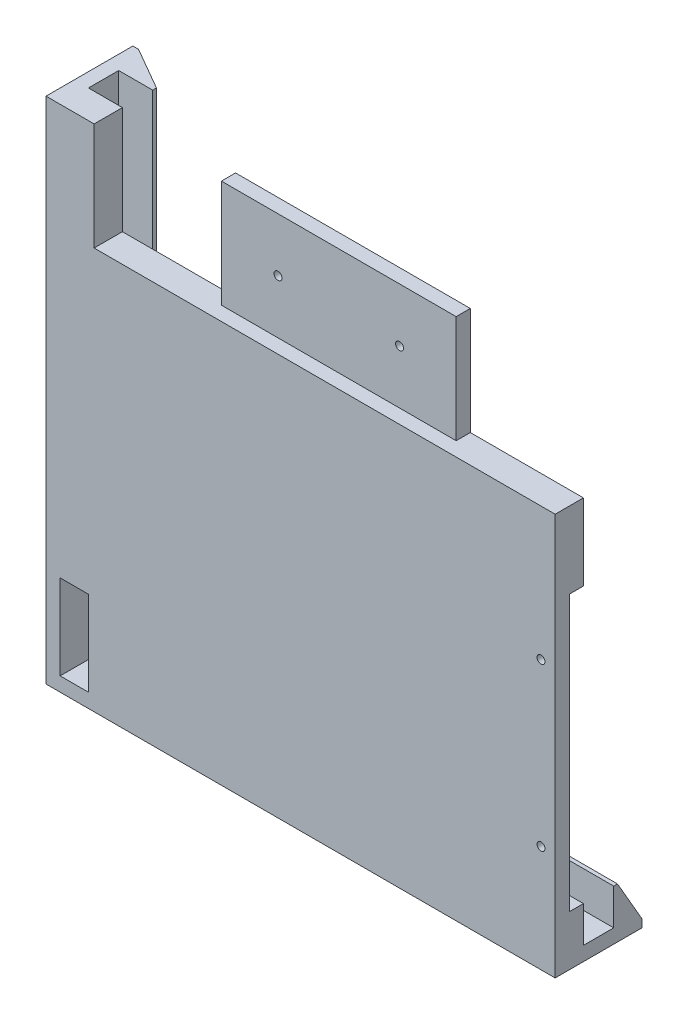
ISO-10303-21;
HEADER;
FILE_DESCRIPTION(('STEP AP214'),'2;1');
FILE_NAME('part.step','',(''),(''),'','','');
FILE_SCHEMA(('AUTOMOTIVE_DESIGN { 1 0 10303 214 1 1 1 1 }'));
ENDSEC;
DATA;
#1=APPLICATION_CONTEXT('core data for automotive mechanical design processes');
#2=APPLICATION_PROTOCOL_DEFINITION('international standard','automotive_design',2000,#1);
#3=PRODUCT_CONTEXT('',#1,'mechanical');
#4=PRODUCT('Part','Part','',(#3));
#5=PRODUCT_RELATED_PRODUCT_CATEGORY('part','',(#4));
#6=PRODUCT_DEFINITION_FORMATION('','',#4);
#7=PRODUCT_DEFINITION_CONTEXT('part definition',#1,'design');
#8=PRODUCT_DEFINITION('design','',#6,#7);
#9=PRODUCT_DEFINITION_SHAPE('','',#8);
#10=(LENGTH_UNIT() NAMED_UNIT(*) SI_UNIT(.MILLI.,.METRE.));
#11=(NAMED_UNIT(*) PLANE_ANGLE_UNIT() SI_UNIT($,.RADIAN.));
#12=(NAMED_UNIT(*) SI_UNIT($,.STERADIAN.) SOLID_ANGLE_UNIT());
#13=UNCERTAINTY_MEASURE_WITH_UNIT(LENGTH_MEASURE(1.E-05),#10,'distance_accuracy_value','');
#14=(GEOMETRIC_REPRESENTATION_CONTEXT(3) GLOBAL_UNCERTAINTY_ASSIGNED_CONTEXT((#13)) GLOBAL_UNIT_ASSIGNED_CONTEXT((#10,
#11,#12)) REPRESENTATION_CONTEXT('',''));
#15=CARTESIAN_POINT('',(0.,0.,0.));
#16=DIRECTION('',(0.,0.,1.));
#17=DIRECTION('',(1.,0.,0.));
#18=AXIS2_PLACEMENT_3D('',#15,#16,#17);
#19=CARTESIAN_POINT('',(0.,180.,30.7));
#20=DIRECTION('',(0.,-1.,0.));
#21=DIRECTION('',(0.,0.,-1.));
#22=AXIS2_PLACEMENT_3D('',#19,#20,#21);
#23=PLANE('',#22);
#24=DIRECTION('',(-1.,0.,0.));
#25=VECTOR('',#24,1.);
#26=CARTESIAN_POINT('',(57.01,180.,25.7));
#27=LINE('',#26,#25);
#28=CARTESIAN_POINT('',(140.,180.,25.7));
#29=VERTEX_POINT('',#28);
#30=CARTESIAN_POINT('',(57.01,180.,25.7));
#31=VERTEX_POINT('',#30);
#32=EDGE_CURVE('E370',#29,#31,#27,.T.);
#33=ORIENTED_EDGE('',*,*,#32,.F.);
#34=DIRECTION('',(0.,0.,-1.));
#35=VECTOR('',#34,1.);
#36=CARTESIAN_POINT('',(140.,180.,30.7));
#37=LINE('',#36,#35);
#38=CARTESIAN_POINT('',(140.,180.,20.7));
#39=VERTEX_POINT('',#38);
#40=EDGE_CURVE('E365',#29,#39,#37,.T.);
#41=ORIENTED_EDGE('',*,*,#40,.T.);
#42=DIRECTION('',(1.,0.,0.));
#43=VECTOR('',#42,1.);
#44=CARTESIAN_POINT('',(180.,180.,20.7));
#45=LINE('',#44,#43);
#46=CARTESIAN_POINT('',(57.01,180.,20.7));
#47=VERTEX_POINT('',#46);
#48=EDGE_CURVE('E255',#47,#39,#45,.T.);
#49=ORIENTED_EDGE('',*,*,#48,.F.);
#50=DIRECTION('',(0.,0.,-1.));
#51=VECTOR('',#50,1.);
#52=CARTESIAN_POINT('',(57.01,180.,30.7));
#53=LINE('',#52,#51);
#54=EDGE_CURVE('E373',#31,#47,#53,.T.);
#55=ORIENTED_EDGE('',*,*,#54,.F.);
#56=EDGE_LOOP('',(#33,#41,#49,#55));
#57=FACE_BOUND('',#56,.T.);
#58=ADVANCED_FACE('F41',(#57),#23,.F.);
#59=CARTESIAN_POINT('',(57.01,142.,30.7));
#60=DIRECTION('',(1.,0.,0.));
#61=DIRECTION('',(0.,0.,-1.));
#62=AXIS2_PLACEMENT_3D('',#59,#60,#61);
#63=PLANE('',#62);
#64=DIRECTION('',(0.,-1.,0.));
#65=VECTOR('',#64,1.);
#66=CARTESIAN_POINT('',(57.01,180.,25.7));
#67=LINE('',#66,#65);
#68=CARTESIAN_POINT('',(57.01,142.,25.7));
#69=VERTEX_POINT('',#68);
#70=EDGE_CURVE('E401',#31,#69,#67,.T.);
#71=ORIENTED_EDGE('',*,*,#70,.F.);
#72=ORIENTED_EDGE('',*,*,#54,.T.);
#73=DIRECTION('',(0.,-1.,0.));
#74=VECTOR('',#73,1.);
#75=CARTESIAN_POINT('',(57.01,142.,20.7));
#76=LINE('',#75,#74);
#77=CARTESIAN_POINT('',(57.01,142.,20.7));
#78=VERTEX_POINT('',#77);
#79=EDGE_CURVE('E367',#47,#78,#76,.T.);
#80=ORIENTED_EDGE('',*,*,#79,.T.);
#81=DIRECTION('',(0.,0.,-1.));
#82=VECTOR('',#81,1.);
#83=CARTESIAN_POINT('',(57.01,142.,30.7));
#84=LINE('',#83,#82);
#85=EDGE_CURVE('E356',#69,#78,#84,.T.);
#86=ORIENTED_EDGE('',*,*,#85,.F.);
#87=EDGE_LOOP('',(#71,#72,#80,#86));
#88=FACE_BOUND('',#87,.T.);
#89=ADVANCED_FACE('F479',(#88),#63,.F.);
#90=CARTESIAN_POINT('',(140.,142.,30.7));
#91=DIRECTION('',(-1.,0.,0.));
#92=DIRECTION('',(0.,0.,1.));
#93=AXIS2_PLACEMENT_3D('',#90,#91,#92);
#94=PLANE('',#93);
#95=DIRECTION('',(0.,1.,0.));
#96=VECTOR('',#95,1.);
#97=CARTESIAN_POINT('',(140.,180.,25.7));
#98=LINE('',#97,#96);
#99=CARTESIAN_POINT('',(140.,142.,25.7));
#100=VERTEX_POINT('',#99);
#101=EDGE_CURVE('E397',#100,#29,#98,.T.);
#102=ORIENTED_EDGE('',*,*,#101,.F.);
#103=DIRECTION('',(0.,0.,-1.));
#104=VECTOR('',#103,1.);
#105=CARTESIAN_POINT('',(140.,142.,30.7));
#106=LINE('',#105,#104);
#107=CARTESIAN_POINT('',(140.,142.,20.7));
#108=VERTEX_POINT('',#107);
#109=EDGE_CURVE('E381',#100,#108,#106,.T.);
#110=ORIENTED_EDGE('',*,*,#109,.T.);
#111=DIRECTION('',(0.,1.,0.));
#112=VECTOR('',#111,1.);
#113=CARTESIAN_POINT('',(140.,142.,20.7));
#114=LINE('',#113,#112);
#115=EDGE_CURVE('E375',#108,#39,#114,.T.);
#116=ORIENTED_EDGE('',*,*,#115,.T.);
#117=ORIENTED_EDGE('',*,*,#40,.F.);
#118=EDGE_LOOP('',(#102,#110,#116,#117));
#119=FACE_BOUND('',#118,.T.);
#120=ADVANCED_FACE('F487',(#119),#94,.F.);
#121=CARTESIAN_POINT('',(0.,0.,30.7));
#122=DIRECTION('',(1.,0.,0.));
#123=DIRECTION('',(0.,0.,-1.));
#124=AXIS2_PLACEMENT_3D('',#121,#122,#123);
#125=PLANE('',#124);
#126=DIRECTION('',(0.,-1.,0.));
#127=VECTOR('',#126,1.);
#128=CARTESIAN_POINT('',(0.,0.,0.));
#129=LINE('',#128,#127);
#130=CARTESIAN_POINT('',(0.,180.,0.));
#131=VERTEX_POINT('',#130);
#132=CARTESIAN_POINT('',(0.,0.,0.));
#133=VERTEX_POINT('',#132);
#134=EDGE_CURVE('E261',#131,#133,#129,.T.);
#135=ORIENTED_EDGE('',*,*,#134,.T.);
#136=DIRECTION('',(0.,0.,-1.));
#137=VECTOR('',#136,1.);
#138=CARTESIAN_POINT('',(0.,0.,30.7));
#139=LINE('',#138,#137);
#140=CARTESIAN_POINT('',(0.,0.,30.7));
#141=VERTEX_POINT('',#140);
#142=EDGE_CURVE('E291',#141,#133,#139,.T.);
#143=ORIENTED_EDGE('',*,*,#142,.F.);
#144=DIRECTION('',(0.,-1.,0.));
#145=VECTOR('',#144,1.);
#146=CARTESIAN_POINT('',(0.,0.,30.7));
#147=LINE('',#146,#145);
#148=CARTESIAN_POINT('',(0.,180.,30.7));
#149=VERTEX_POINT('',#148);
#150=EDGE_CURVE('E266',#149,#141,#147,.T.);
#151=ORIENTED_EDGE('',*,*,#150,.F.);
#152=DIRECTION('',(0.,0.,-1.));
#153=VECTOR('',#152,1.);
#154=CARTESIAN_POINT('',(0.,180.,30.7));
#155=LINE('',#154,#153);
#156=EDGE_CURVE('E277',#149,#131,#155,.T.);
#157=ORIENTED_EDGE('',*,*,#156,.T.);
#158=EDGE_LOOP('',(#135,#143,#151,#157));
#159=FACE_BOUND('',#158,.T.);
#160=ADVANCED_FACE('F343',(#159),#125,.F.);
#161=CARTESIAN_POINT('',(0.,0.,30.7));
#162=DIRECTION('',(0.,1.,0.));
#163=DIRECTION('',(0.,0.,1.));
#164=AXIS2_PLACEMENT_3D('',#161,#162,#163);
#165=PLANE('',#164);
#166=DIRECTION('',(1.,0.,0.));
#167=VECTOR('',#166,1.);
#168=CARTESIAN_POINT('',(0.,0.,0.));
#169=LINE('',#168,#167);
#170=CARTESIAN_POINT('',(180.,0.,0.));
#171=VERTEX_POINT('',#170);
#172=EDGE_CURVE('E280',#133,#171,#169,.T.);
#173=ORIENTED_EDGE('',*,*,#172,.T.);
#174=DIRECTION('',(0.,0.,-1.));
#175=VECTOR('',#174,1.);
#176=CARTESIAN_POINT('',(180.,0.,30.7));
#177=LINE('',#176,#175);
#178=CARTESIAN_POINT('',(180.,0.,30.7));
#179=VERTEX_POINT('',#178);
#180=EDGE_CURVE('E288',#179,#171,#177,.T.);
#181=ORIENTED_EDGE('',*,*,#180,.F.);
#182=DIRECTION('',(1.,0.,0.));
#183=VECTOR('',#182,1.);
#184=CARTESIAN_POINT('',(0.,0.,30.7));
#185=LINE('',#184,#183);
#186=EDGE_CURVE('E269',#141,#179,#185,.T.);
#187=ORIENTED_EDGE('',*,*,#186,.F.);
#188=ORIENTED_EDGE('',*,*,#142,.T.);
#189=EDGE_LOOP('',(#173,#181,#187,#188));
#190=FACE_BOUND('',#189,.T.);
#191=ADVANCED_FACE('F501',(#190),#165,.F.);
#192=CARTESIAN_POINT('',(180.,0.,30.7));
#193=DIRECTION('',(-1.,0.,0.));
#194=DIRECTION('',(0.,0.,1.));
#195=AXIS2_PLACEMENT_3D('',#192,#193,#194);
#196=PLANE('',#195);
#197=DIRECTION('',(0.,1.,0.));
#198=VECTOR('',#197,1.);
#199=CARTESIAN_POINT('',(180.,0.,0.));
#200=LINE('',#199,#198);
#201=CARTESIAN_POINT('',(180.,2.7899999999999,0.));
#202=VERTEX_POINT('',#201);
#203=EDGE_CURVE('E282',#171,#202,#200,.T.);
#204=ORIENTED_EDGE('',*,*,#203,.T.);
#205=DIRECTION('',(0.,0.86602540378444,0.499999999999997));
#206=VECTOR('',#205,1.);
#207=CARTESIAN_POINT('',(180.,17.79,8.66025403784437));
#208=LINE('',#207,#206);
#209=CARTESIAN_POINT('',(180.,17.79,8.66025403784437));
#210=VERTEX_POINT('',#209);
#211=EDGE_CURVE('E317',#202,#210,#208,.T.);
#212=ORIENTED_EDGE('',*,*,#211,.T.);
#213=DIRECTION('',(0.,0.,-1.));
#214=VECTOR('',#213,1.);
#215=CARTESIAN_POINT('',(180.,17.79,20.7));
#216=LINE('',#215,#214);
#217=CARTESIAN_POINT('',(180.,17.79,10.));
#218=VERTEX_POINT('',#217);
#219=EDGE_CURVE('E258',#218,#210,#216,.T.);
#220=ORIENTED_EDGE('',*,*,#219,.F.);
#221=DIRECTION('',(0.,1.,0.));
#222=VECTOR('',#221,1.);
#223=CARTESIAN_POINT('',(180.,-175.326809130834,10.));
#224=LINE('',#223,#222);
#225=CARTESIAN_POINT('',(180.,5.,10.));
#226=VERTEX_POINT('',#225);
#227=EDGE_CURVE('E239',#226,#218,#224,.T.);
#228=ORIENTED_EDGE('',*,*,#227,.F.);
#229=DIRECTION('',(0.,0.,1.));
#230=VECTOR('',#229,1.);
#231=CARTESIAN_POINT('',(180.,5.,20.7));
#232=LINE('',#231,#230);
#233=CARTESIAN_POINT('',(180.,5.,20.7));
#234=VERTEX_POINT('',#233);
#235=EDGE_CURVE('E248',#226,#234,#232,.T.);
#236=ORIENTED_EDGE('',*,*,#235,.T.);
#237=DIRECTION('',(0.,-1.,0.));
#238=VECTOR('',#237,1.);
#239=CARTESIAN_POINT('',(180.,17.79,20.7));
#240=LINE('',#239,#238);
#241=CARTESIAN_POINT('',(180.,17.79,20.7));
#242=VERTEX_POINT('',#241);
#243=EDGE_CURVE('E251',#242,#234,#240,.T.);
#244=ORIENTED_EDGE('',*,*,#243,.F.);
#245=DIRECTION('',(0.,0.,-1.));
#246=VECTOR('',#245,1.);
#247=CARTESIAN_POINT('',(180.,17.79,25.7));
#248=LINE('',#247,#246);
#249=CARTESIAN_POINT('',(180.,17.79,25.7));
#250=VERTEX_POINT('',#249);
#251=EDGE_CURVE('E412',#250,#242,#248,.T.);
#252=ORIENTED_EDGE('',*,*,#251,.F.);
#253=DIRECTION('',(0.,-1.,0.));
#254=VECTOR('',#253,1.);
#255=CARTESIAN_POINT('',(180.,115.,25.7));
#256=LINE('',#255,#254);
#257=CARTESIAN_POINT('',(180.,115.,25.7));
#258=VERTEX_POINT('',#257);
#259=EDGE_CURVE('E426',#258,#250,#256,.T.);
#260=ORIENTED_EDGE('',*,*,#259,.F.);
#261=DIRECTION('',(0.,0.,-1.));
#262=VECTOR('',#261,1.);
#263=CARTESIAN_POINT('',(180.,115.,25.7));
#264=LINE('',#263,#262);
#265=CARTESIAN_POINT('',(180.,115.,20.7));
#266=VERTEX_POINT('',#265);
#267=EDGE_CURVE('E408',#258,#266,#264,.T.);
#268=ORIENTED_EDGE('',*,*,#267,.T.);
#269=CARTESIAN_POINT('',(180.,142.,20.7));
#270=VERTEX_POINT('',#269);
#271=EDGE_CURVE('E252',#270,#266,#240,.T.);
#272=ORIENTED_EDGE('',*,*,#271,.F.);
#273=DIRECTION('',(0.,0.,-1.));
#274=VECTOR('',#273,1.);
#275=CARTESIAN_POINT('',(180.,142.,30.7));
#276=LINE('',#275,#274);
#277=CARTESIAN_POINT('',(180.,142.,30.7));
#278=VERTEX_POINT('',#277);
#279=EDGE_CURVE('E384',#278,#270,#276,.T.);
#280=ORIENTED_EDGE('',*,*,#279,.F.);
#281=DIRECTION('',(0.,1.,0.));
#282=VECTOR('',#281,1.);
#283=CARTESIAN_POINT('',(180.,0.,30.7));
#284=LINE('',#283,#282);
#285=EDGE_CURVE('E272',#179,#278,#284,.T.);
#286=ORIENTED_EDGE('',*,*,#285,.F.);
#287=ORIENTED_EDGE('',*,*,#180,.T.);
#288=EDGE_LOOP('',(#204,#212,#220,#228,#236,#244,#252,#260,#268,#272,#280,#286,#287));
#289=FACE_BOUND('',#288,.T.);
#290=ADVANCED_FACE('F322',(#289),#196,.F.);
#291=DIRECTION('',(0.,0.,-1.));
#292=VECTOR('',#291,1.);
#293=CARTESIAN_POINT('',(17.01,180.,20.7));
#294=LINE('',#293,#292);
#295=CARTESIAN_POINT('',(17.01,180.,10.));
#296=VERTEX_POINT('',#295);
#297=CARTESIAN_POINT('',(17.01,180.,8.66025403784437));
#298=VERTEX_POINT('',#297);
#299=EDGE_CURVE('E259',#296,#298,#294,.T.);
#300=ORIENTED_EDGE('',*,*,#299,.T.);
#301=DIRECTION('',(-0.86602540378444,0.,-0.499999999999997));
#302=VECTOR('',#301,1.);
#303=CARTESIAN_POINT('',(17.01,180.,8.66025403784437));
#304=LINE('',#303,#302);
#305=CARTESIAN_POINT('',(2.0099999999999,180.,0.));
#306=VERTEX_POINT('',#305);
#307=EDGE_CURVE('E12',#298,#306,#304,.T.);
#308=ORIENTED_EDGE('',*,*,#307,.T.);
#309=DIRECTION('',(-1.,0.,0.));
#310=VECTOR('',#309,1.);
#311=CARTESIAN_POINT('',(0.,180.,0.));
#312=LINE('',#311,#310);
#313=EDGE_CURVE('E270',#306,#131,#312,.T.);
#314=ORIENTED_EDGE('',*,*,#313,.T.);
#315=ORIENTED_EDGE('',*,*,#156,.F.);
#316=DIRECTION('',(-1.,0.,0.));
#317=VECTOR('',#316,1.);
#318=CARTESIAN_POINT('',(0.,180.,30.7));
#319=LINE('',#318,#317);
#320=CARTESIAN_POINT('',(17.01,180.,30.7));
#321=VERTEX_POINT('',#320);
#322=EDGE_CURVE('E275',#321,#149,#319,.T.);
#323=ORIENTED_EDGE('',*,*,#322,.F.);
#324=DIRECTION('',(0.,0.,-1.));
#325=VECTOR('',#324,1.);
#326=CARTESIAN_POINT('',(17.01,180.,30.7));
#327=LINE('',#326,#325);
#328=CARTESIAN_POINT('',(17.01,180.,20.7));
#329=VERTEX_POINT('',#328);
#330=EDGE_CURVE('E347',#321,#329,#327,.T.);
#331=ORIENTED_EDGE('',*,*,#330,.T.);
#332=CARTESIAN_POINT('',(5.,180.,20.7));
#333=VERTEX_POINT('',#332);
#334=EDGE_CURVE('E256',#333,#329,#45,.T.);
#335=ORIENTED_EDGE('',*,*,#334,.F.);
#336=DIRECTION('',(0.,0.,1.));
#337=VECTOR('',#336,1.);
#338=CARTESIAN_POINT('',(5.,180.,20.7));
#339=LINE('',#338,#337);
#340=CARTESIAN_POINT('',(5.,180.,10.));
#341=VERTEX_POINT('',#340);
#342=EDGE_CURVE('E233',#341,#333,#339,.T.);
#343=ORIENTED_EDGE('',*,*,#342,.F.);
#344=DIRECTION('',(-1.,0.,0.));
#345=VECTOR('',#344,1.);
#346=CARTESIAN_POINT('',(180.,180.,10.));
#347=LINE('',#346,#345);
#348=EDGE_CURVE('E380',#296,#341,#347,.T.);
#349=ORIENTED_EDGE('',*,*,#348,.F.);
#350=EDGE_LOOP('',(#300,#308,#314,#315,#323,#331,#335,#343,#349));
#351=FACE_BOUND('',#350,.T.);
#352=ADVANCED_FACE('F336',(#351),#23,.F.);
#353=CARTESIAN_POINT('',(0.,0.,30.7));
#354=DIRECTION('',(0.,0.,-1.));
#355=DIRECTION('',(-1.,0.,0.));
#356=AXIS2_PLACEMENT_3D('',#353,#354,#355);
#357=PLANE('',#356);
#358=CARTESIAN_POINT('',(175.,37.79,30.7));
#359=DIRECTION('',(0.,0.,-1.));
#360=DIRECTION('',(-1.,0.,0.));
#361=AXIS2_PLACEMENT_3D('',#358,#359,#360);
#362=CIRCLE('',#361,1.4);
#363=CARTESIAN_POINT('',(173.6,37.79,30.7));
#364=VERTEX_POINT('',#363);
#365=EDGE_CURVE('E306',#364,#364,#362,.T.);
#366=ORIENTED_EDGE('',*,*,#365,.T.);
#367=EDGE_LOOP('',(#366));
#368=FACE_BOUND('',#367,.T.);
#369=CARTESIAN_POINT('',(175.,95.,30.7));
#370=DIRECTION('',(0.,0.,-1.));
#371=DIRECTION('',(-1.,0.,0.));
#372=AXIS2_PLACEMENT_3D('',#369,#370,#371);
#373=CIRCLE('',#372,1.4);
#374=CARTESIAN_POINT('',(173.6,95.,30.7));
#375=VERTEX_POINT('',#374);
#376=EDGE_CURVE('E301',#375,#375,#373,.T.);
#377=ORIENTED_EDGE('',*,*,#376,.T.);
#378=EDGE_LOOP('',(#377));
#379=FACE_BOUND('',#378,.T.);
#380=DIRECTION('',(-1.,0.,0.));
#381=VECTOR('',#380,1.);
#382=CARTESIAN_POINT('',(0.,5.,30.7));
#383=LINE('',#382,#381);
#384=CARTESIAN_POINT('',(15.,5.,30.7));
#385=VERTEX_POINT('',#384);
#386=CARTESIAN_POINT('',(5.,5.,30.7));
#387=VERTEX_POINT('',#386);
#388=EDGE_CURVE('E434',#385,#387,#383,.T.);
#389=ORIENTED_EDGE('',*,*,#388,.T.);
#390=DIRECTION('',(0.,1.,0.));
#391=VECTOR('',#390,1.);
#392=CARTESIAN_POINT('',(5.,0.,30.7));
#393=LINE('',#392,#391);
#394=CARTESIAN_POINT('',(5.,35.,30.7));
#395=VERTEX_POINT('',#394);
#396=EDGE_CURVE('E423',#387,#395,#393,.T.);
#397=ORIENTED_EDGE('',*,*,#396,.T.);
#398=DIRECTION('',(1.,0.,0.));
#399=VECTOR('',#398,1.);
#400=CARTESIAN_POINT('',(0.,35.,30.7));
#401=LINE('',#400,#399);
#402=CARTESIAN_POINT('',(15.,35.,30.7));
#403=VERTEX_POINT('',#402);
#404=EDGE_CURVE('E213',#395,#403,#401,.T.);
#405=ORIENTED_EDGE('',*,*,#404,.T.);
#406=DIRECTION('',(0.,-1.,0.));
#407=VECTOR('',#406,1.);
#408=CARTESIAN_POINT('',(15.,0.,30.7));
#409=LINE('',#408,#407);
#410=EDGE_CURVE('E437',#403,#385,#409,.T.);
#411=ORIENTED_EDGE('',*,*,#410,.T.);
#412=EDGE_LOOP('',(#389,#397,#405,#411));
#413=FACE_BOUND('',#412,.T.);
#414=DIRECTION('',(-1.,0.,0.));
#415=VECTOR('',#414,1.);
#416=CARTESIAN_POINT('',(140.,142.,30.7));
#417=LINE('',#416,#415);
#418=CARTESIAN_POINT('',(17.01,142.,30.7));
#419=VERTEX_POINT('',#418);
#420=EDGE_CURVE('E353',#278,#419,#417,.T.);
#421=ORIENTED_EDGE('',*,*,#420,.T.);
#422=DIRECTION('',(0.,1.,0.));
#423=VECTOR('',#422,1.);
#424=CARTESIAN_POINT('',(17.01,142.,30.7));
#425=LINE('',#424,#423);
#426=EDGE_CURVE('E352',#419,#321,#425,.T.);
#427=ORIENTED_EDGE('',*,*,#426,.T.);
#428=ORIENTED_EDGE('',*,*,#322,.T.);
#429=ORIENTED_EDGE('',*,*,#150,.T.);
#430=ORIENTED_EDGE('',*,*,#186,.T.);
#431=ORIENTED_EDGE('',*,*,#285,.T.);
#432=EDGE_LOOP('',(#421,#427,#428,#429,#430,#431));
#433=FACE_BOUND('',#432,.T.);
#434=ADVANCED_FACE('F350',(#368,#379,#413,#433),#357,.F.);
#435=CARTESIAN_POINT('',(0.,0.,0.));
#436=DIRECTION('',(0.,0.,-1.));
#437=DIRECTION('',(-1.,0.,0.));
#438=AXIS2_PLACEMENT_3D('',#435,#436,#437);
#439=PLANE('',#438);
#440=DIRECTION('',(0.,-1.,0.));
#441=VECTOR('',#440,1.);
#442=CARTESIAN_POINT('',(2.0099999999999,17.79,0.));
#443=LINE('',#442,#441);
#444=CARTESIAN_POINT('',(2.0099999999999,2.7899999999999,0.));
#445=VERTEX_POINT('',#444);
#446=EDGE_CURVE('E64',#306,#445,#443,.T.);
#447=ORIENTED_EDGE('',*,*,#446,.T.);
#448=DIRECTION('',(1.,0.,0.));
#449=VECTOR('',#448,1.);
#450=CARTESIAN_POINT('',(180.,2.7899999999999,0.));
#451=LINE('',#450,#449);
#452=EDGE_CURVE('E315',#445,#202,#451,.T.);
#453=ORIENTED_EDGE('',*,*,#452,.T.);
#454=ORIENTED_EDGE('',*,*,#203,.F.);
#455=ORIENTED_EDGE('',*,*,#172,.F.);
#456=ORIENTED_EDGE('',*,*,#134,.F.);
#457=ORIENTED_EDGE('',*,*,#313,.F.);
#458=EDGE_LOOP('',(#447,#453,#454,#455,#456,#457));
#459=FACE_BOUND('',#458,.T.);
#460=ADVANCED_FACE('F340',(#459),#439,.T.);
#461=CARTESIAN_POINT('',(17.01,17.79,20.7));
#462=DIRECTION('',(-1.,0.,0.));
#463=DIRECTION('',(0.,0.,1.));
#464=AXIS2_PLACEMENT_3D('',#461,#462,#463);
#465=PLANE('',#464);
#466=DIRECTION('',(0.,0.,-1.));
#467=VECTOR('',#466,1.);
#468=CARTESIAN_POINT('',(17.01,17.79,20.7));
#469=LINE('',#468,#467);
#470=CARTESIAN_POINT('',(17.01,17.79,10.));
#471=VERTEX_POINT('',#470);
#472=CARTESIAN_POINT('',(17.01,17.79,8.66025403784437));
#473=VERTEX_POINT('',#472);
#474=EDGE_CURVE('E262',#471,#473,#469,.T.);
#475=ORIENTED_EDGE('',*,*,#474,.T.);
#476=DIRECTION('',(0.,1.,0.));
#477=VECTOR('',#476,1.);
#478=CARTESIAN_POINT('',(17.01,180.,8.66025403784437));
#479=LINE('',#478,#477);
#480=EDGE_CURVE('E50',#473,#298,#479,.T.);
#481=ORIENTED_EDGE('',*,*,#480,.T.);
#482=ORIENTED_EDGE('',*,*,#299,.F.);
#483=DIRECTION('',(0.,-1.,0.));
#484=VECTOR('',#483,1.);
#485=CARTESIAN_POINT('',(17.01,17.79,10.));
#486=LINE('',#485,#484);
#487=EDGE_CURVE('E247',#296,#471,#486,.T.);
#488=ORIENTED_EDGE('',*,*,#487,.T.);
#489=EDGE_LOOP('',(#475,#481,#482,#488));
#490=FACE_BOUND('',#489,.T.);
#491=ADVANCED_FACE('F696',(#490),#465,.F.);
#492=CARTESIAN_POINT('',(180.,17.79,20.7));
#493=DIRECTION('',(0.,-1.,0.));
#494=DIRECTION('',(0.,0.,-1.));
#495=AXIS2_PLACEMENT_3D('',#492,#493,#494);
#496=PLANE('',#495);
#497=ORIENTED_EDGE('',*,*,#219,.T.);
#498=DIRECTION('',(-1.,0.,0.));
#499=VECTOR('',#498,1.);
#500=CARTESIAN_POINT('',(17.01,17.79,8.66025403784437));
#501=LINE('',#500,#499);
#502=EDGE_CURVE('E297',#210,#473,#501,.T.);
#503=ORIENTED_EDGE('',*,*,#502,.T.);
#504=ORIENTED_EDGE('',*,*,#474,.F.);
#505=DIRECTION('',(1.,0.,0.));
#506=VECTOR('',#505,1.);
#507=CARTESIAN_POINT('',(180.,17.79,10.));
#508=LINE('',#507,#506);
#509=EDGE_CURVE('E294',#471,#218,#508,.T.);
#510=ORIENTED_EDGE('',*,*,#509,.T.);
#511=EDGE_LOOP('',(#497,#503,#504,#510));
#512=FACE_BOUND('',#511,.T.);
#513=ADVANCED_FACE('F328',(#512),#496,.F.);
#514=CARTESIAN_POINT('',(0.,0.,20.7));
#515=DIRECTION('',(0.,0.,1.));
#516=DIRECTION('',(1.,0.,0.));
#517=AXIS2_PLACEMENT_3D('',#514,#515,#516);
#518=PLANE('',#517);
#519=CARTESIAN_POINT('',(77.01,161.,20.7));
#520=DIRECTION('',(0.,0.,-1.));
#521=DIRECTION('',(-1.,0.,0.));
#522=AXIS2_PLACEMENT_3D('',#519,#520,#521);
#523=CIRCLE('',#522,1.40000000000003);
#524=CARTESIAN_POINT('',(75.61,161.,20.7));
#525=VERTEX_POINT('',#524);
#526=EDGE_CURVE('E333',#525,#525,#523,.T.);
#527=ORIENTED_EDGE('',*,*,#526,.F.);
#528=EDGE_LOOP('',(#527));
#529=FACE_BOUND('',#528,.T.);
#530=CARTESIAN_POINT('',(120.,161.,20.7));
#531=DIRECTION('',(0.,0.,-1.));
#532=DIRECTION('',(-1.,0.,0.));
#533=AXIS2_PLACEMENT_3D('',#530,#531,#532);
#534=CIRCLE('',#533,1.40000000000003);
#535=CARTESIAN_POINT('',(118.6,161.,20.7));
#536=VERTEX_POINT('',#535);
#537=EDGE_CURVE('E302',#536,#536,#534,.T.);
#538=ORIENTED_EDGE('',*,*,#537,.F.);
#539=EDGE_LOOP('',(#538));
#540=FACE_BOUND('',#539,.T.);
#541=DIRECTION('',(-1.,0.,0.));
#542=VECTOR('',#541,1.);
#543=CARTESIAN_POINT('',(180.,5.,20.7));
#544=LINE('',#543,#542);
#545=CARTESIAN_POINT('',(15.,5.,20.7));
#546=VERTEX_POINT('',#545);
#547=EDGE_CURVE('E237',#234,#546,#544,.T.);
#548=ORIENTED_EDGE('',*,*,#547,.T.);
#549=DIRECTION('',(0.,-1.,0.));
#550=VECTOR('',#549,1.);
#551=CARTESIAN_POINT('',(15.,5.,20.7));
#552=LINE('',#551,#550);
#553=CARTESIAN_POINT('',(15.,35.,20.7));
#554=VERTEX_POINT('',#553);
#555=EDGE_CURVE('E219',#554,#546,#552,.T.);
#556=ORIENTED_EDGE('',*,*,#555,.F.);
#557=DIRECTION('',(1.,0.,0.));
#558=VECTOR('',#557,1.);
#559=CARTESIAN_POINT('',(5.,35.,20.7));
#560=LINE('',#559,#558);
#561=CARTESIAN_POINT('',(5.,35.,20.7));
#562=VERTEX_POINT('',#561);
#563=EDGE_CURVE('E210',#562,#554,#560,.T.);
#564=ORIENTED_EDGE('',*,*,#563,.F.);
#565=DIRECTION('',(0.,1.,0.));
#566=VECTOR('',#565,1.);
#567=CARTESIAN_POINT('',(5.,-175.326809130834,20.7));
#568=LINE('',#567,#566);
#569=EDGE_CURVE('E225',#562,#333,#568,.T.);
#570=ORIENTED_EDGE('',*,*,#569,.T.);
#571=ORIENTED_EDGE('',*,*,#334,.T.);
#572=DIRECTION('',(0.,1.,0.));
#573=VECTOR('',#572,1.);
#574=CARTESIAN_POINT('',(17.01,142.,20.7));
#575=LINE('',#574,#573);
#576=CARTESIAN_POINT('',(17.01,142.,20.7));
#577=VERTEX_POINT('',#576);
#578=EDGE_CURVE('E357',#577,#329,#575,.T.);
#579=ORIENTED_EDGE('',*,*,#578,.F.);
#580=DIRECTION('',(-1.,0.,0.));
#581=VECTOR('',#580,1.);
#582=CARTESIAN_POINT('',(57.01,142.,20.7));
#583=LINE('',#582,#581);
#584=EDGE_CURVE('E361',#78,#577,#583,.T.);
#585=ORIENTED_EDGE('',*,*,#584,.F.);
#586=ORIENTED_EDGE('',*,*,#79,.F.);
#587=ORIENTED_EDGE('',*,*,#48,.T.);
#588=ORIENTED_EDGE('',*,*,#115,.F.);
#589=DIRECTION('',(-1.,0.,0.));
#590=VECTOR('',#589,1.);
#591=CARTESIAN_POINT('',(140.,142.,20.7));
#592=LINE('',#591,#590);
#593=EDGE_CURVE('E392',#270,#108,#592,.T.);
#594=ORIENTED_EDGE('',*,*,#593,.F.);
#595=ORIENTED_EDGE('',*,*,#271,.T.);
#596=DIRECTION('',(1.,0.,0.));
#597=VECTOR('',#596,1.);
#598=CARTESIAN_POINT('',(170.,115.,20.7));
#599=LINE('',#598,#597);
#600=CARTESIAN_POINT('',(170.,115.,20.7));
#601=VERTEX_POINT('',#600);
#602=EDGE_CURVE('E419',#601,#266,#599,.T.);
#603=ORIENTED_EDGE('',*,*,#602,.F.);
#604=DIRECTION('',(0.,1.,0.));
#605=VECTOR('',#604,1.);
#606=CARTESIAN_POINT('',(170.,115.,20.7));
#607=LINE('',#606,#605);
#608=CARTESIAN_POINT('',(170.,17.79,20.7));
#609=VERTEX_POINT('',#608);
#610=EDGE_CURVE('E421',#609,#601,#607,.T.);
#611=ORIENTED_EDGE('',*,*,#610,.F.);
#612=DIRECTION('',(-1.,0.,0.));
#613=VECTOR('',#612,1.);
#614=CARTESIAN_POINT('',(170.,17.79,20.7));
#615=LINE('',#614,#613);
#616=EDGE_CURVE('E415',#242,#609,#615,.T.);
#617=ORIENTED_EDGE('',*,*,#616,.F.);
#618=ORIENTED_EDGE('',*,*,#243,.T.);
#619=EDGE_LOOP('',(#548,#556,#564,#570,#571,#579,#585,#586,#587,#588,#594,#595,#603,#611,#617,#618));
#620=FACE_BOUND('',#619,.T.);
#621=ADVANCED_FACE('F223',(#529,#540,#620),#518,.F.);
#622=CARTESIAN_POINT('',(180.,-175.326809130834,10.));
#623=DIRECTION('',(0.,0.,-1.));
#624=DIRECTION('',(-1.,0.,0.));
#625=AXIS2_PLACEMENT_3D('',#622,#623,#624);
#626=PLANE('',#625);
#627=ORIENTED_EDGE('',*,*,#348,.T.);
#628=DIRECTION('',(0.,1.,0.));
#629=VECTOR('',#628,1.);
#630=CARTESIAN_POINT('',(5.,-175.326809130834,10.));
#631=LINE('',#630,#629);
#632=CARTESIAN_POINT('',(5.,4.99999999999995,10.));
#633=VERTEX_POINT('',#632);
#634=EDGE_CURVE('E235',#633,#341,#631,.T.);
#635=ORIENTED_EDGE('',*,*,#634,.F.);
#636=DIRECTION('',(1.,0.,0.));
#637=VECTOR('',#636,1.);
#638=CARTESIAN_POINT('',(180.,5.,10.));
#639=LINE('',#638,#637);
#640=EDGE_CURVE('E245',#633,#226,#639,.T.);
#641=ORIENTED_EDGE('',*,*,#640,.T.);
#642=ORIENTED_EDGE('',*,*,#227,.T.);
#643=ORIENTED_EDGE('',*,*,#509,.F.);
#644=ORIENTED_EDGE('',*,*,#487,.F.);
#645=EDGE_LOOP('',(#627,#635,#641,#642,#643,#644));
#646=FACE_BOUND('',#645,.T.);
#647=ADVANCED_FACE('F459',(#646),#626,.F.);
#648=CARTESIAN_POINT('',(5.,-175.326809130834,20.7));
#649=DIRECTION('',(-1.,0.,0.));
#650=DIRECTION('',(0.,0.,1.));
#651=AXIS2_PLACEMENT_3D('',#648,#649,#650);
#652=PLANE('',#651);
#653=DIRECTION('',(0.,0.,-1.));
#654=VECTOR('',#653,1.);
#655=CARTESIAN_POINT('',(5.,5.,20.7));
#656=LINE('',#655,#654);
#657=EDGE_CURVE('E234',#387,#633,#656,.T.);
#658=ORIENTED_EDGE('',*,*,#657,.T.);
#659=ORIENTED_EDGE('',*,*,#634,.T.);
#660=ORIENTED_EDGE('',*,*,#342,.T.);
#661=ORIENTED_EDGE('',*,*,#569,.F.);
#662=DIRECTION('',(0.,0.,-1.));
#663=VECTOR('',#662,1.);
#664=CARTESIAN_POINT('',(5.,35.,40.7));
#665=LINE('',#664,#663);
#666=EDGE_CURVE('E207',#395,#562,#665,.T.);
#667=ORIENTED_EDGE('',*,*,#666,.F.);
#668=ORIENTED_EDGE('',*,*,#396,.F.);
#669=EDGE_LOOP('',(#658,#659,#660,#661,#667,#668));
#670=FACE_BOUND('',#669,.T.);
#671=ADVANCED_FACE('F230',(#670),#652,.F.);
#672=CARTESIAN_POINT('',(0.,5.,30.7));
#673=DIRECTION('',(0.,1.,0.));
#674=DIRECTION('',(0.,0.,1.));
#675=AXIS2_PLACEMENT_3D('',#672,#673,#674);
#676=PLANE('',#675);
#677=ORIENTED_EDGE('',*,*,#235,.F.);
#678=ORIENTED_EDGE('',*,*,#640,.F.);
#679=ORIENTED_EDGE('',*,*,#657,.F.);
#680=ORIENTED_EDGE('',*,*,#388,.F.);
#681=DIRECTION('',(0.,0.,-1.));
#682=VECTOR('',#681,1.);
#683=CARTESIAN_POINT('',(15.,5.,40.7));
#684=LINE('',#683,#682);
#685=EDGE_CURVE('E440',#385,#546,#684,.T.);
#686=ORIENTED_EDGE('',*,*,#685,.T.);
#687=ORIENTED_EDGE('',*,*,#547,.F.);
#688=EDGE_LOOP('',(#677,#678,#679,#680,#686,#687));
#689=FACE_BOUND('',#688,.T.);
#690=ADVANCED_FACE('F599',(#689),#676,.T.);
#691=CARTESIAN_POINT('',(17.01,142.,30.7));
#692=DIRECTION('',(-1.,0.,0.));
#693=DIRECTION('',(0.,0.,1.));
#694=AXIS2_PLACEMENT_3D('',#691,#692,#693);
#695=PLANE('',#694);
#696=ORIENTED_EDGE('',*,*,#578,.T.);
#697=ORIENTED_EDGE('',*,*,#330,.F.);
#698=ORIENTED_EDGE('',*,*,#426,.F.);
#699=DIRECTION('',(0.,0.,-1.));
#700=VECTOR('',#699,1.);
#701=CARTESIAN_POINT('',(17.01,142.,30.7));
#702=LINE('',#701,#700);
#703=EDGE_CURVE('E359',#419,#577,#702,.T.);
#704=ORIENTED_EDGE('',*,*,#703,.T.);
#705=EDGE_LOOP('',(#696,#697,#698,#704));
#706=FACE_BOUND('',#705,.T.);
#707=ADVANCED_FACE('F603',(#706),#695,.F.);
#708=CARTESIAN_POINT('',(140.,142.,30.7));
#709=DIRECTION('',(0.,-1.,0.));
#710=DIRECTION('',(0.,0.,-1.));
#711=AXIS2_PLACEMENT_3D('',#708,#709,#710);
#712=PLANE('',#711);
#713=ORIENTED_EDGE('',*,*,#593,.T.);
#714=ORIENTED_EDGE('',*,*,#109,.F.);
#715=DIRECTION('',(1.,0.,0.));
#716=VECTOR('',#715,1.);
#717=CARTESIAN_POINT('',(57.01,142.,25.7));
#718=LINE('',#717,#716);
#719=EDGE_CURVE('E399',#69,#100,#718,.T.);
#720=ORIENTED_EDGE('',*,*,#719,.F.);
#721=ORIENTED_EDGE('',*,*,#85,.T.);
#722=ORIENTED_EDGE('',*,*,#584,.T.);
#723=ORIENTED_EDGE('',*,*,#703,.F.);
#724=ORIENTED_EDGE('',*,*,#420,.F.);
#725=ORIENTED_EDGE('',*,*,#279,.T.);
#726=EDGE_LOOP('',(#713,#714,#720,#721,#722,#723,#724,#725));
#727=FACE_BOUND('',#726,.T.);
#728=ADVANCED_FACE('F566',(#727),#712,.F.);
#729=CARTESIAN_POINT('',(0.,0.,25.7));
#730=DIRECTION('',(0.,0.,1.));
#731=DIRECTION('',(1.,0.,0.));
#732=AXIS2_PLACEMENT_3D('',#729,#730,#731);
#733=PLANE('',#732);
#734=CARTESIAN_POINT('',(77.01,161.,25.7));
#735=DIRECTION('',(0.,0.,1.));
#736=DIRECTION('',(1.,0.,0.));
#737=AXIS2_PLACEMENT_3D('',#734,#735,#736);
#738=CIRCLE('',#737,1.40000000000003);
#739=CARTESIAN_POINT('',(78.4100000000001,161.,25.7));
#740=VERTEX_POINT('',#739);
#741=EDGE_CURVE('E227',#740,#740,#738,.T.);
#742=ORIENTED_EDGE('',*,*,#741,.F.);
#743=EDGE_LOOP('',(#742));
#744=FACE_BOUND('',#743,.T.);
#745=CARTESIAN_POINT('',(120.,161.,25.7));
#746=DIRECTION('',(0.,0.,1.));
#747=DIRECTION('',(1.,0.,0.));
#748=AXIS2_PLACEMENT_3D('',#745,#746,#747);
#749=CIRCLE('',#748,1.40000000000003);
#750=CARTESIAN_POINT('',(121.4,161.,25.7));
#751=VERTEX_POINT('',#750);
#752=EDGE_CURVE('E307',#751,#751,#749,.T.);
#753=ORIENTED_EDGE('',*,*,#752,.F.);
#754=EDGE_LOOP('',(#753));
#755=FACE_BOUND('',#754,.T.);
#756=ORIENTED_EDGE('',*,*,#70,.T.);
#757=ORIENTED_EDGE('',*,*,#719,.T.);
#758=ORIENTED_EDGE('',*,*,#101,.T.);
#759=ORIENTED_EDGE('',*,*,#32,.T.);
#760=EDGE_LOOP('',(#756,#757,#758,#759));
#761=FACE_BOUND('',#760,.T.);
#762=ADVANCED_FACE('F562',(#744,#755,#761),#733,.T.);
#763=CARTESIAN_POINT('',(170.,115.,25.7));
#764=DIRECTION('',(-1.,0.,0.));
#765=DIRECTION('',(0.,0.,1.));
#766=AXIS2_PLACEMENT_3D('',#763,#764,#765);
#767=PLANE('',#766);
#768=ORIENTED_EDGE('',*,*,#610,.T.);
#769=DIRECTION('',(0.,0.,-1.));
#770=VECTOR('',#769,1.);
#771=CARTESIAN_POINT('',(170.,115.,25.7));
#772=LINE('',#771,#770);
#773=CARTESIAN_POINT('',(170.,115.,25.7));
#774=VERTEX_POINT('',#773);
#775=EDGE_CURVE('E405',#774,#601,#772,.T.);
#776=ORIENTED_EDGE('',*,*,#775,.F.);
#777=DIRECTION('',(0.,1.,0.));
#778=VECTOR('',#777,1.);
#779=CARTESIAN_POINT('',(170.,115.,25.7));
#780=LINE('',#779,#778);
#781=CARTESIAN_POINT('',(170.,17.79,25.7));
#782=VERTEX_POINT('',#781);
#783=EDGE_CURVE('E418',#782,#774,#780,.T.);
#784=ORIENTED_EDGE('',*,*,#783,.F.);
#785=DIRECTION('',(0.,0.,-1.));
#786=VECTOR('',#785,1.);
#787=CARTESIAN_POINT('',(170.,17.79,25.7));
#788=LINE('',#787,#786);
#789=EDGE_CURVE('E404',#782,#609,#788,.T.);
#790=ORIENTED_EDGE('',*,*,#789,.T.);
#791=EDGE_LOOP('',(#768,#776,#784,#790));
#792=FACE_BOUND('',#791,.T.);
#793=ADVANCED_FACE('F565',(#792),#767,.F.);
#794=CARTESIAN_POINT('',(170.,17.79,25.7));
#795=DIRECTION('',(0.,-1.,0.));
#796=DIRECTION('',(0.,0.,-1.));
#797=AXIS2_PLACEMENT_3D('',#794,#795,#796);
#798=PLANE('',#797);
#799=ORIENTED_EDGE('',*,*,#616,.T.);
#800=ORIENTED_EDGE('',*,*,#789,.F.);
#801=DIRECTION('',(-1.,0.,0.));
#802=VECTOR('',#801,1.);
#803=CARTESIAN_POINT('',(170.,17.79,25.7));
#804=LINE('',#803,#802);
#805=EDGE_CURVE('E409',#250,#782,#804,.T.);
#806=ORIENTED_EDGE('',*,*,#805,.F.);
#807=ORIENTED_EDGE('',*,*,#251,.T.);
#808=EDGE_LOOP('',(#799,#800,#806,#807));
#809=FACE_BOUND('',#808,.T.);
#810=ADVANCED_FACE('F620',(#809),#798,.F.);
#811=CARTESIAN_POINT('',(170.,115.,25.7));
#812=DIRECTION('',(0.,1.,0.));
#813=DIRECTION('',(0.,0.,1.));
#814=AXIS2_PLACEMENT_3D('',#811,#812,#813);
#815=PLANE('',#814);
#816=ORIENTED_EDGE('',*,*,#602,.T.);
#817=ORIENTED_EDGE('',*,*,#267,.F.);
#818=DIRECTION('',(1.,0.,0.));
#819=VECTOR('',#818,1.);
#820=CARTESIAN_POINT('',(170.,115.,25.7));
#821=LINE('',#820,#819);
#822=EDGE_CURVE('E428',#774,#258,#821,.T.);
#823=ORIENTED_EDGE('',*,*,#822,.F.);
#824=ORIENTED_EDGE('',*,*,#775,.T.);
#825=EDGE_LOOP('',(#816,#817,#823,#824));
#826=FACE_BOUND('',#825,.T.);
#827=ADVANCED_FACE('F552',(#826),#815,.F.);
#828=CARTESIAN_POINT('',(0.,0.,25.7));
#829=DIRECTION('',(0.,0.,1.));
#830=DIRECTION('',(1.,0.,0.));
#831=AXIS2_PLACEMENT_3D('',#828,#829,#830);
#832=PLANE('',#831);
#833=CARTESIAN_POINT('',(175.,37.79,25.7));
#834=DIRECTION('',(0.,0.,1.));
#835=DIRECTION('',(1.,0.,0.));
#836=AXIS2_PLACEMENT_3D('',#833,#834,#835);
#837=CIRCLE('',#836,1.4);
#838=CARTESIAN_POINT('',(176.4,37.79,25.7));
#839=VERTEX_POINT('',#838);
#840=EDGE_CURVE('E303',#839,#839,#837,.T.);
#841=ORIENTED_EDGE('',*,*,#840,.T.);
#842=EDGE_LOOP('',(#841));
#843=FACE_BOUND('',#842,.T.);
#844=CARTESIAN_POINT('',(175.,95.,25.7));
#845=DIRECTION('',(0.,0.,1.));
#846=DIRECTION('',(1.,0.,0.));
#847=AXIS2_PLACEMENT_3D('',#844,#845,#846);
#848=CIRCLE('',#847,1.4);
#849=CARTESIAN_POINT('',(176.4,95.,25.7));
#850=VERTEX_POINT('',#849);
#851=EDGE_CURVE('E298',#850,#850,#848,.T.);
#852=ORIENTED_EDGE('',*,*,#851,.T.);
#853=EDGE_LOOP('',(#852));
#854=FACE_BOUND('',#853,.T.);
#855=ORIENTED_EDGE('',*,*,#783,.T.);
#856=ORIENTED_EDGE('',*,*,#822,.T.);
#857=ORIENTED_EDGE('',*,*,#259,.T.);
#858=ORIENTED_EDGE('',*,*,#805,.T.);
#859=EDGE_LOOP('',(#855,#856,#857,#858));
#860=FACE_BOUND('',#859,.T.);
#861=ADVANCED_FACE('F546',(#843,#854,#860),#832,.F.);
#862=CARTESIAN_POINT('',(15.,5.,40.7));
#863=DIRECTION('',(1.,0.,0.));
#864=DIRECTION('',(0.,0.,-1.));
#865=AXIS2_PLACEMENT_3D('',#862,#863,#864);
#866=PLANE('',#865);
#867=DIRECTION('',(0.,0.,-1.));
#868=VECTOR('',#867,1.);
#869=CARTESIAN_POINT('',(15.,35.,40.7));
#870=LINE('',#869,#868);
#871=EDGE_CURVE('E218',#403,#554,#870,.T.);
#872=ORIENTED_EDGE('',*,*,#871,.T.);
#873=ORIENTED_EDGE('',*,*,#555,.T.);
#874=ORIENTED_EDGE('',*,*,#685,.F.);
#875=ORIENTED_EDGE('',*,*,#410,.F.);
#876=EDGE_LOOP('',(#872,#873,#874,#875));
#877=FACE_BOUND('',#876,.T.);
#878=ADVANCED_FACE('F551',(#877),#866,.F.);
#879=CARTESIAN_POINT('',(5.,35.,40.7));
#880=DIRECTION('',(0.,1.,0.));
#881=DIRECTION('',(0.,0.,1.));
#882=AXIS2_PLACEMENT_3D('',#879,#880,#881);
#883=PLANE('',#882);
#884=ORIENTED_EDGE('',*,*,#666,.T.);
#885=ORIENTED_EDGE('',*,*,#563,.T.);
#886=ORIENTED_EDGE('',*,*,#871,.F.);
#887=ORIENTED_EDGE('',*,*,#404,.F.);
#888=EDGE_LOOP('',(#884,#885,#886,#887));
#889=FACE_BOUND('',#888,.T.);
#890=ADVANCED_FACE('F209',(#889),#883,.F.);
#891=CARTESIAN_POINT('',(175.,95.,40.7));
#892=DIRECTION('',(0.,0.,-1.));
#893=DIRECTION('',(-1.,0.,0.));
#894=AXIS2_PLACEMENT_3D('',#891,#892,#893);
#895=CYLINDRICAL_SURFACE('',#894,1.4);
#896=ORIENTED_EDGE('',*,*,#851,.F.);
#897=EDGE_LOOP('',(#896));
#898=FACE_BOUND('',#897,.T.);
#899=ORIENTED_EDGE('',*,*,#376,.F.);
#900=EDGE_LOOP('',(#899));
#901=FACE_BOUND('',#900,.T.);
#902=ADVANCED_FACE('F474',(#898,#901),#895,.F.);
#903=CARTESIAN_POINT('',(175.,37.79,40.7));
#904=DIRECTION('',(0.,0.,-1.));
#905=DIRECTION('',(-1.,0.,0.));
#906=AXIS2_PLACEMENT_3D('',#903,#904,#905);
#907=CYLINDRICAL_SURFACE('',#906,1.4);
#908=ORIENTED_EDGE('',*,*,#840,.F.);
#909=EDGE_LOOP('',(#908));
#910=FACE_BOUND('',#909,.T.);
#911=ORIENTED_EDGE('',*,*,#365,.F.);
#912=EDGE_LOOP('',(#911));
#913=FACE_BOUND('',#912,.T.);
#914=ADVANCED_FACE('F465',(#910,#913),#907,.F.);
#915=CARTESIAN_POINT('',(120.,161.,40.7));
#916=DIRECTION('',(0.,0.,-1.));
#917=DIRECTION('',(-1.,0.,0.));
#918=AXIS2_PLACEMENT_3D('',#915,#916,#917);
#919=CYLINDRICAL_SURFACE('',#918,1.40000000000003);
#920=ORIENTED_EDGE('',*,*,#752,.T.);
#921=EDGE_LOOP('',(#920));
#922=FACE_BOUND('',#921,.T.);
#923=ORIENTED_EDGE('',*,*,#537,.T.);
#924=EDGE_LOOP('',(#923));
#925=FACE_BOUND('',#924,.T.);
#926=ADVANCED_FACE('F463',(#922,#925),#919,.F.);
#927=CARTESIAN_POINT('',(77.01,161.,40.7));
#928=DIRECTION('',(0.,0.,-1.));
#929=DIRECTION('',(-1.,0.,0.));
#930=AXIS2_PLACEMENT_3D('',#927,#928,#929);
#931=CYLINDRICAL_SURFACE('',#930,1.40000000000003);
#932=ORIENTED_EDGE('',*,*,#741,.T.);
#933=EDGE_LOOP('',(#932));
#934=FACE_BOUND('',#933,.T.);
#935=ORIENTED_EDGE('',*,*,#526,.T.);
#936=EDGE_LOOP('',(#935));
#937=FACE_BOUND('',#936,.T.);
#938=ADVANCED_FACE('F455',(#934,#937),#931,.F.);
#939=CARTESIAN_POINT('',(17.01,17.79,8.66025403784437));
#940=DIRECTION('',(0.499999999999997,0.,-0.86602540378444));
#941=DIRECTION('',(0.,-1.,0.));
#942=AXIS2_PLACEMENT_3D('',#939,#940,#941);
#943=PLANE('',#942);
#944=ORIENTED_EDGE('',*,*,#307,.F.);
#945=ORIENTED_EDGE('',*,*,#480,.F.);
#946=DIRECTION('',(-0.654653670707978,-0.654653670707978,-0.377964473009225));
#947=VECTOR('',#946,1.);
#948=CARTESIAN_POINT('',(86.8628571428573,87.6428571428573,48.9898199129372));
#949=LINE('',#948,#947);
#950=EDGE_CURVE('E45',#445,#473,#949,.F.);
#951=ORIENTED_EDGE('',*,*,#950,.F.);
#952=ORIENTED_EDGE('',*,*,#446,.F.);
#953=EDGE_LOOP('',(#944,#945,#951,#952));
#954=FACE_BOUND('',#953,.T.);
#955=ADVANCED_FACE('F43',(#954),#943,.T.);
#956=CARTESIAN_POINT('',(180.,17.79,8.66025403784437));
#957=DIRECTION('',(0.,0.499999999999997,-0.86602540378444));
#958=DIRECTION('',(1.,0.,0.));
#959=AXIS2_PLACEMENT_3D('',#956,#957,#958);
#960=PLANE('',#959);
#961=ORIENTED_EDGE('',*,*,#211,.F.);
#962=ORIENTED_EDGE('',*,*,#452,.F.);
#963=ORIENTED_EDGE('',*,*,#950,.T.);
#964=ORIENTED_EDGE('',*,*,#502,.F.);
#965=EDGE_LOOP('',(#961,#962,#963,#964));
#966=FACE_BOUND('',#965,.T.);
#967=ADVANCED_FACE('F330',(#966),#960,.T.);
#968=CLOSED_SHELL('',(#58,#89,#120,#160,#191,#290,#352,#434,#460,#491,#513,#621,#647,#671,#690,
#707,#728,#762,#793,#810,#827,#861,#878,#890,#902,#914,#926,#938,#955,#967));
#969=MANIFOLD_SOLID_BREP('B2',#968);
#970=ADVANCED_BREP_SHAPE_REPRESENTATION('',(#18,#969),#14);
#971=SHAPE_DEFINITION_REPRESENTATION(#9,#970);
ENDSEC;
END-ISO-10303-21;
